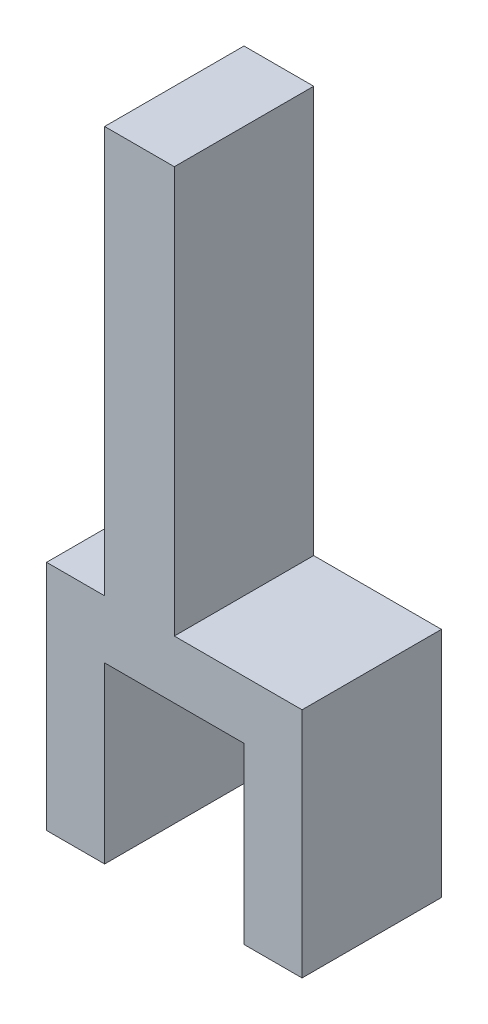
ISO-10303-21;
HEADER;
FILE_DESCRIPTION(('STEP AP214'),'2;1');
FILE_NAME('part.step','',(''),(''),'','','');
FILE_SCHEMA(('AUTOMOTIVE_DESIGN { 1 0 10303 214 1 1 1 1 }'));
ENDSEC;
DATA;
#1=APPLICATION_CONTEXT('core data for automotive mechanical design processes');
#2=APPLICATION_PROTOCOL_DEFINITION('international standard','automotive_design',2000,#1);
#3=PRODUCT_CONTEXT('',#1,'mechanical');
#4=PRODUCT('Part','Part','',(#3));
#5=PRODUCT_RELATED_PRODUCT_CATEGORY('part','',(#4));
#6=PRODUCT_DEFINITION_FORMATION('','',#4);
#7=PRODUCT_DEFINITION_CONTEXT('part definition',#1,'design');
#8=PRODUCT_DEFINITION('design','',#6,#7);
#9=PRODUCT_DEFINITION_SHAPE('','',#8);
#10=(LENGTH_UNIT() NAMED_UNIT(*) SI_UNIT(.MILLI.,.METRE.));
#11=(NAMED_UNIT(*) PLANE_ANGLE_UNIT() SI_UNIT($,.RADIAN.));
#12=(NAMED_UNIT(*) SI_UNIT($,.STERADIAN.) SOLID_ANGLE_UNIT());
#13=UNCERTAINTY_MEASURE_WITH_UNIT(LENGTH_MEASURE(1.E-05),#10,'distance_accuracy_value','');
#14=(GEOMETRIC_REPRESENTATION_CONTEXT(3) GLOBAL_UNCERTAINTY_ASSIGNED_CONTEXT((#13)) GLOBAL_UNIT_ASSIGNED_CONTEXT((#10,
#11,#12)) REPRESENTATION_CONTEXT('',''));
#15=CARTESIAN_POINT('',(0.,0.,0.));
#16=DIRECTION('',(0.,0.,1.));
#17=DIRECTION('',(1.,0.,0.));
#18=AXIS2_PLACEMENT_3D('',#15,#16,#17);
#19=CARTESIAN_POINT('',(0.,20.,12.));
#20=DIRECTION('',(1.,0.,0.));
#21=DIRECTION('',(0.,0.,-1.));
#22=AXIS2_PLACEMENT_3D('',#19,#20,#21);
#23=PLANE('',#22);
#24=DIRECTION('',(0.,-1.,0.));
#25=VECTOR('',#24,1.);
#26=CARTESIAN_POINT('',(0.,20.,0.));
#27=LINE('',#26,#25);
#28=CARTESIAN_POINT('',(0.,20.,0.));
#29=VERTEX_POINT('',#28);
#30=CARTESIAN_POINT('',(0.,0.,0.));
#31=VERTEX_POINT('',#30);
#32=EDGE_CURVE('E155',#29,#31,#27,.T.);
#33=ORIENTED_EDGE('',*,*,#32,.T.);
#34=DIRECTION('',(0.,0.,-1.));
#35=VECTOR('',#34,1.);
#36=CARTESIAN_POINT('',(0.,0.,12.));
#37=LINE('',#36,#35);
#38=CARTESIAN_POINT('',(0.,0.,12.));
#39=VERTEX_POINT('',#38);
#40=EDGE_CURVE('E11',#39,#31,#37,.T.);
#41=ORIENTED_EDGE('',*,*,#40,.F.);
#42=DIRECTION('',(0.,-1.,0.));
#43=VECTOR('',#42,1.);
#44=CARTESIAN_POINT('',(0.,20.,12.));
#45=LINE('',#44,#43);
#46=CARTESIAN_POINT('',(0.,20.,12.));
#47=VERTEX_POINT('',#46);
#48=EDGE_CURVE('E177',#47,#39,#45,.T.);
#49=ORIENTED_EDGE('',*,*,#48,.F.);
#50=DIRECTION('',(0.,0.,-1.));
#51=VECTOR('',#50,1.);
#52=CARTESIAN_POINT('',(0.,20.,12.));
#53=LINE('',#52,#51);
#54=EDGE_CURVE('E151',#47,#29,#53,.T.);
#55=ORIENTED_EDGE('',*,*,#54,.T.);
#56=EDGE_LOOP('',(#33,#41,#49,#55));
#57=FACE_BOUND('',#56,.T.);
#58=ADVANCED_FACE('F35',(#57),#23,.F.);
#59=CARTESIAN_POINT('',(0.,0.,12.));
#60=DIRECTION('',(0.,1.,0.));
#61=DIRECTION('',(0.,0.,1.));
#62=AXIS2_PLACEMENT_3D('',#59,#60,#61);
#63=PLANE('',#62);
#64=DIRECTION('',(1.,0.,0.));
#65=VECTOR('',#64,1.);
#66=CARTESIAN_POINT('',(0.,0.,0.));
#67=LINE('',#66,#65);
#68=CARTESIAN_POINT('',(5.,0.,0.));
#69=VERTEX_POINT('',#68);
#70=EDGE_CURVE('E158',#31,#69,#67,.T.);
#71=ORIENTED_EDGE('',*,*,#70,.T.);
#72=DIRECTION('',(0.,0.,-1.));
#73=VECTOR('',#72,1.);
#74=CARTESIAN_POINT('',(5.,0.,12.));
#75=LINE('',#74,#73);
#76=CARTESIAN_POINT('',(5.,0.,12.));
#77=VERTEX_POINT('',#76);
#78=EDGE_CURVE('E43',#77,#69,#75,.T.);
#79=ORIENTED_EDGE('',*,*,#78,.F.);
#80=DIRECTION('',(1.,0.,0.));
#81=VECTOR('',#80,1.);
#82=CARTESIAN_POINT('',(0.,0.,12.));
#83=LINE('',#82,#81);
#84=EDGE_CURVE('E106',#39,#77,#83,.T.);
#85=ORIENTED_EDGE('',*,*,#84,.F.);
#86=ORIENTED_EDGE('',*,*,#40,.T.);
#87=EDGE_LOOP('',(#71,#79,#85,#86));
#88=FACE_BOUND('',#87,.T.);
#89=ADVANCED_FACE('F255',(#88),#63,.F.);
#90=CARTESIAN_POINT('',(5.,0.,12.));
#91=DIRECTION('',(-1.,0.,0.));
#92=DIRECTION('',(0.,0.,1.));
#93=AXIS2_PLACEMENT_3D('',#90,#91,#92);
#94=PLANE('',#93);
#95=DIRECTION('',(0.,1.,0.));
#96=VECTOR('',#95,1.);
#97=CARTESIAN_POINT('',(5.,0.,0.));
#98=LINE('',#97,#96);
#99=CARTESIAN_POINT('',(5.,15.,0.));
#100=VERTEX_POINT('',#99);
#101=EDGE_CURVE('E160',#69,#100,#98,.T.);
#102=ORIENTED_EDGE('',*,*,#101,.T.);
#103=DIRECTION('',(0.,0.,-1.));
#104=VECTOR('',#103,1.);
#105=CARTESIAN_POINT('',(5.,15.,12.));
#106=LINE('',#105,#104);
#107=CARTESIAN_POINT('',(5.,15.,12.));
#108=VERTEX_POINT('',#107);
#109=EDGE_CURVE('E196',#108,#100,#106,.T.);
#110=ORIENTED_EDGE('',*,*,#109,.F.);
#111=DIRECTION('',(0.,1.,0.));
#112=VECTOR('',#111,1.);
#113=CARTESIAN_POINT('',(5.,0.,12.));
#114=LINE('',#113,#112);
#115=EDGE_CURVE('E204',#77,#108,#114,.T.);
#116=ORIENTED_EDGE('',*,*,#115,.F.);
#117=ORIENTED_EDGE('',*,*,#78,.T.);
#118=EDGE_LOOP('',(#102,#110,#116,#117));
#119=FACE_BOUND('',#118,.T.);
#120=ADVANCED_FACE('F202',(#119),#94,.F.);
#121=CARTESIAN_POINT('',(5.,15.,12.));
#122=DIRECTION('',(0.,1.,0.));
#123=DIRECTION('',(0.,0.,1.));
#124=AXIS2_PLACEMENT_3D('',#121,#122,#123);
#125=PLANE('',#124);
#126=DIRECTION('',(1.,0.,0.));
#127=VECTOR('',#126,1.);
#128=CARTESIAN_POINT('',(5.,15.,0.));
#129=LINE('',#128,#127);
#130=CARTESIAN_POINT('',(17.,15.,0.));
#131=VERTEX_POINT('',#130);
#132=EDGE_CURVE('E162',#100,#131,#129,.T.);
#133=ORIENTED_EDGE('',*,*,#132,.T.);
#134=DIRECTION('',(0.,0.,-1.));
#135=VECTOR('',#134,1.);
#136=CARTESIAN_POINT('',(17.,15.,12.));
#137=LINE('',#136,#135);
#138=CARTESIAN_POINT('',(17.,15.,12.));
#139=VERTEX_POINT('',#138);
#140=EDGE_CURVE('E193',#139,#131,#137,.T.);
#141=ORIENTED_EDGE('',*,*,#140,.F.);
#142=DIRECTION('',(1.,0.,0.));
#143=VECTOR('',#142,1.);
#144=CARTESIAN_POINT('',(5.,15.,12.));
#145=LINE('',#144,#143);
#146=EDGE_CURVE('E222',#108,#139,#145,.T.);
#147=ORIENTED_EDGE('',*,*,#146,.F.);
#148=ORIENTED_EDGE('',*,*,#109,.T.);
#149=EDGE_LOOP('',(#133,#141,#147,#148));
#150=FACE_BOUND('',#149,.T.);
#151=ADVANCED_FACE('F213',(#150),#125,.F.);
#152=CARTESIAN_POINT('',(17.,15.,12.));
#153=DIRECTION('',(1.,0.,0.));
#154=DIRECTION('',(0.,0.,-1.));
#155=AXIS2_PLACEMENT_3D('',#152,#153,#154);
#156=PLANE('',#155);
#157=DIRECTION('',(0.,-1.,0.));
#158=VECTOR('',#157,1.);
#159=CARTESIAN_POINT('',(17.,15.,0.));
#160=LINE('',#159,#158);
#161=CARTESIAN_POINT('',(17.,0.,0.));
#162=VERTEX_POINT('',#161);
#163=EDGE_CURVE('E164',#131,#162,#160,.T.);
#164=ORIENTED_EDGE('',*,*,#163,.T.);
#165=DIRECTION('',(0.,0.,-1.));
#166=VECTOR('',#165,1.);
#167=CARTESIAN_POINT('',(17.,0.,12.));
#168=LINE('',#167,#166);
#169=CARTESIAN_POINT('',(17.,0.,12.));
#170=VERTEX_POINT('',#169);
#171=EDGE_CURVE('E190',#170,#162,#168,.T.);
#172=ORIENTED_EDGE('',*,*,#171,.F.);
#173=DIRECTION('',(0.,-1.,0.));
#174=VECTOR('',#173,1.);
#175=CARTESIAN_POINT('',(17.,15.,12.));
#176=LINE('',#175,#174);
#177=EDGE_CURVE('E219',#139,#170,#176,.T.);
#178=ORIENTED_EDGE('',*,*,#177,.F.);
#179=ORIENTED_EDGE('',*,*,#140,.T.);
#180=EDGE_LOOP('',(#164,#172,#178,#179));
#181=FACE_BOUND('',#180,.T.);
#182=ADVANCED_FACE('F217',(#181),#156,.F.);
#183=CARTESIAN_POINT('',(17.,0.,12.));
#184=DIRECTION('',(0.,1.,0.));
#185=DIRECTION('',(0.,0.,1.));
#186=AXIS2_PLACEMENT_3D('',#183,#184,#185);
#187=PLANE('',#186);
#188=DIRECTION('',(1.,0.,0.));
#189=VECTOR('',#188,1.);
#190=CARTESIAN_POINT('',(17.,0.,0.));
#191=LINE('',#190,#189);
#192=CARTESIAN_POINT('',(22.,0.,0.));
#193=VERTEX_POINT('',#192);
#194=EDGE_CURVE('E166',#162,#193,#191,.T.);
#195=ORIENTED_EDGE('',*,*,#194,.T.);
#196=DIRECTION('',(0.,0.,-1.));
#197=VECTOR('',#196,1.);
#198=CARTESIAN_POINT('',(22.,0.,12.));
#199=LINE('',#198,#197);
#200=CARTESIAN_POINT('',(22.,0.,12.));
#201=VERTEX_POINT('',#200);
#202=EDGE_CURVE('E187',#201,#193,#199,.T.);
#203=ORIENTED_EDGE('',*,*,#202,.F.);
#204=DIRECTION('',(1.,0.,0.));
#205=VECTOR('',#204,1.);
#206=CARTESIAN_POINT('',(17.,0.,12.));
#207=LINE('',#206,#205);
#208=EDGE_CURVE('E221',#170,#201,#207,.T.);
#209=ORIENTED_EDGE('',*,*,#208,.F.);
#210=ORIENTED_EDGE('',*,*,#171,.T.);
#211=EDGE_LOOP('',(#195,#203,#209,#210));
#212=FACE_BOUND('',#211,.T.);
#213=ADVANCED_FACE('F268',(#212),#187,.F.);
#214=CARTESIAN_POINT('',(22.,0.,12.));
#215=DIRECTION('',(-1.,0.,0.));
#216=DIRECTION('',(0.,-1.,0.));
#217=AXIS2_PLACEMENT_3D('',#214,#215,#216);
#218=PLANE('',#217);
#219=DIRECTION('',(0.,1.,0.));
#220=VECTOR('',#219,1.);
#221=CARTESIAN_POINT('',(22.,0.,0.));
#222=LINE('',#221,#220);
#223=CARTESIAN_POINT('',(22.,20.,0.));
#224=VERTEX_POINT('',#223);
#225=EDGE_CURVE('E168',#193,#224,#222,.T.);
#226=ORIENTED_EDGE('',*,*,#225,.T.);
#227=DIRECTION('',(0.,0.,-1.));
#228=VECTOR('',#227,1.);
#229=CARTESIAN_POINT('',(22.,20.,12.));
#230=LINE('',#229,#228);
#231=CARTESIAN_POINT('',(22.,20.,12.));
#232=VERTEX_POINT('',#231);
#233=EDGE_CURVE('E184',#232,#224,#230,.T.);
#234=ORIENTED_EDGE('',*,*,#233,.F.);
#235=DIRECTION('',(0.,1.,0.));
#236=VECTOR('',#235,1.);
#237=CARTESIAN_POINT('',(22.,0.,12.));
#238=LINE('',#237,#236);
#239=EDGE_CURVE('E224',#201,#232,#238,.T.);
#240=ORIENTED_EDGE('',*,*,#239,.F.);
#241=ORIENTED_EDGE('',*,*,#202,.T.);
#242=EDGE_LOOP('',(#226,#234,#240,#241));
#243=FACE_BOUND('',#242,.T.);
#244=ADVANCED_FACE('F271',(#243),#218,.F.);
#245=CARTESIAN_POINT('',(22.,20.,12.));
#246=DIRECTION('',(0.,-1.,0.));
#247=DIRECTION('',(1.,0.,0.));
#248=AXIS2_PLACEMENT_3D('',#245,#246,#247);
#249=PLANE('',#248);
#250=DIRECTION('',(-1.,0.,0.));
#251=VECTOR('',#250,1.);
#252=CARTESIAN_POINT('',(22.,20.,0.));
#253=LINE('',#252,#251);
#254=CARTESIAN_POINT('',(11.,20.,0.));
#255=VERTEX_POINT('',#254);
#256=EDGE_CURVE('E170',#224,#255,#253,.T.);
#257=ORIENTED_EDGE('',*,*,#256,.T.);
#258=DIRECTION('',(0.,0.,-1.));
#259=VECTOR('',#258,1.);
#260=CARTESIAN_POINT('',(11.,20.,12.));
#261=LINE('',#260,#259);
#262=CARTESIAN_POINT('',(11.,20.,12.));
#263=VERTEX_POINT('',#262);
#264=EDGE_CURVE('E181',#263,#255,#261,.T.);
#265=ORIENTED_EDGE('',*,*,#264,.F.);
#266=DIRECTION('',(-1.,0.,0.));
#267=VECTOR('',#266,1.);
#268=CARTESIAN_POINT('',(22.,20.,12.));
#269=LINE('',#268,#267);
#270=EDGE_CURVE('E230',#232,#263,#269,.T.);
#271=ORIENTED_EDGE('',*,*,#270,.F.);
#272=ORIENTED_EDGE('',*,*,#233,.T.);
#273=EDGE_LOOP('',(#257,#265,#271,#272));
#274=FACE_BOUND('',#273,.T.);
#275=ADVANCED_FACE('F236',(#274),#249,.F.);
#276=CARTESIAN_POINT('',(11.,20.,12.));
#277=DIRECTION('',(-1.,0.,0.));
#278=DIRECTION('',(0.,0.,1.));
#279=AXIS2_PLACEMENT_3D('',#276,#277,#278);
#280=PLANE('',#279);
#281=DIRECTION('',(0.,1.,0.));
#282=VECTOR('',#281,1.);
#283=CARTESIAN_POINT('',(11.,20.,0.));
#284=LINE('',#283,#282);
#285=CARTESIAN_POINT('',(11.,55.,0.));
#286=VERTEX_POINT('',#285);
#287=EDGE_CURVE('E172',#255,#286,#284,.T.);
#288=ORIENTED_EDGE('',*,*,#287,.T.);
#289=DIRECTION('',(0.,0.,-1.));
#290=VECTOR('',#289,1.);
#291=CARTESIAN_POINT('',(11.,55.,12.));
#292=LINE('',#291,#290);
#293=CARTESIAN_POINT('',(11.,55.,12.));
#294=VERTEX_POINT('',#293);
#295=EDGE_CURVE('E146',#294,#286,#292,.T.);
#296=ORIENTED_EDGE('',*,*,#295,.F.);
#297=DIRECTION('',(0.,1.,0.));
#298=VECTOR('',#297,1.);
#299=CARTESIAN_POINT('',(11.,20.,12.));
#300=LINE('',#299,#298);
#301=EDGE_CURVE('E137',#263,#294,#300,.T.);
#302=ORIENTED_EDGE('',*,*,#301,.F.);
#303=ORIENTED_EDGE('',*,*,#264,.T.);
#304=EDGE_LOOP('',(#288,#296,#302,#303));
#305=FACE_BOUND('',#304,.T.);
#306=ADVANCED_FACE('F240',(#305),#280,.F.);
#307=CARTESIAN_POINT('',(11.,55.,12.));
#308=DIRECTION('',(0.,-1.,0.));
#309=DIRECTION('',(0.,0.,-1.));
#310=AXIS2_PLACEMENT_3D('',#307,#308,#309);
#311=PLANE('',#310);
#312=DIRECTION('',(-1.,0.,0.));
#313=VECTOR('',#312,1.);
#314=CARTESIAN_POINT('',(11.,55.,0.));
#315=LINE('',#314,#313);
#316=CARTESIAN_POINT('',(5.,55.,0.));
#317=VERTEX_POINT('',#316);
#318=EDGE_CURVE('E145',#286,#317,#315,.T.);
#319=ORIENTED_EDGE('',*,*,#318,.T.);
#320=DIRECTION('',(0.,0.,-1.));
#321=VECTOR('',#320,1.);
#322=CARTESIAN_POINT('',(5.,55.,12.));
#323=LINE('',#322,#321);
#324=CARTESIAN_POINT('',(5.,55.,12.));
#325=VERTEX_POINT('',#324);
#326=EDGE_CURVE('E142',#325,#317,#323,.T.);
#327=ORIENTED_EDGE('',*,*,#326,.F.);
#328=DIRECTION('',(-1.,0.,0.));
#329=VECTOR('',#328,1.);
#330=CARTESIAN_POINT('',(11.,55.,12.));
#331=LINE('',#330,#329);
#332=EDGE_CURVE('E131',#294,#325,#331,.T.);
#333=ORIENTED_EDGE('',*,*,#332,.F.);
#334=ORIENTED_EDGE('',*,*,#295,.T.);
#335=EDGE_LOOP('',(#319,#327,#333,#334));
#336=FACE_BOUND('',#335,.T.);
#337=ADVANCED_FACE('F143',(#336),#311,.F.);
#338=CARTESIAN_POINT('',(5.,55.,12.));
#339=DIRECTION('',(1.,0.,0.));
#340=DIRECTION('',(0.,1.,0.));
#341=AXIS2_PLACEMENT_3D('',#338,#339,#340);
#342=PLANE('',#341);
#343=DIRECTION('',(0.,-1.,0.));
#344=VECTOR('',#343,1.);
#345=CARTESIAN_POINT('',(5.,55.,0.));
#346=LINE('',#345,#344);
#347=CARTESIAN_POINT('',(5.,20.,0.));
#348=VERTEX_POINT('',#347);
#349=EDGE_CURVE('E92',#317,#348,#346,.T.);
#350=ORIENTED_EDGE('',*,*,#349,.T.);
#351=DIRECTION('',(0.,0.,-1.));
#352=VECTOR('',#351,1.);
#353=CARTESIAN_POINT('',(5.,20.,12.));
#354=LINE('',#353,#352);
#355=CARTESIAN_POINT('',(5.,20.,12.));
#356=VERTEX_POINT('',#355);
#357=EDGE_CURVE('E147',#356,#348,#354,.T.);
#358=ORIENTED_EDGE('',*,*,#357,.F.);
#359=DIRECTION('',(0.,-1.,0.));
#360=VECTOR('',#359,1.);
#361=CARTESIAN_POINT('',(5.,55.,12.));
#362=LINE('',#361,#360);
#363=EDGE_CURVE('E135',#325,#356,#362,.T.);
#364=ORIENTED_EDGE('',*,*,#363,.F.);
#365=ORIENTED_EDGE('',*,*,#326,.T.);
#366=EDGE_LOOP('',(#350,#358,#364,#365));
#367=FACE_BOUND('',#366,.T.);
#368=ADVANCED_FACE('F149',(#367),#342,.F.);
#369=CARTESIAN_POINT('',(5.,20.,12.));
#370=DIRECTION('',(0.,-1.,0.));
#371=DIRECTION('',(0.,0.,-1.));
#372=AXIS2_PLACEMENT_3D('',#369,#370,#371);
#373=PLANE('',#372);
#374=DIRECTION('',(-1.,0.,0.));
#375=VECTOR('',#374,1.);
#376=CARTESIAN_POINT('',(5.,20.,0.));
#377=LINE('',#376,#375);
#378=EDGE_CURVE('E98',#348,#29,#377,.T.);
#379=ORIENTED_EDGE('',*,*,#378,.T.);
#380=ORIENTED_EDGE('',*,*,#54,.F.);
#381=DIRECTION('',(-1.,0.,0.));
#382=VECTOR('',#381,1.);
#383=CARTESIAN_POINT('',(5.,20.,12.));
#384=LINE('',#383,#382);
#385=EDGE_CURVE('E51',#356,#47,#384,.T.);
#386=ORIENTED_EDGE('',*,*,#385,.F.);
#387=ORIENTED_EDGE('',*,*,#357,.T.);
#388=EDGE_LOOP('',(#379,#380,#386,#387));
#389=FACE_BOUND('',#388,.T.);
#390=ADVANCED_FACE('F244',(#389),#373,.F.);
#391=CARTESIAN_POINT('',(0.,0.,12.));
#392=DIRECTION('',(0.,0.,1.));
#393=DIRECTION('',(1.,0.,0.));
#394=AXIS2_PLACEMENT_3D('',#391,#392,#393);
#395=PLANE('',#394);
#396=ORIENTED_EDGE('',*,*,#48,.T.);
#397=ORIENTED_EDGE('',*,*,#84,.T.);
#398=ORIENTED_EDGE('',*,*,#115,.T.);
#399=ORIENTED_EDGE('',*,*,#146,.T.);
#400=ORIENTED_EDGE('',*,*,#177,.T.);
#401=ORIENTED_EDGE('',*,*,#208,.T.);
#402=ORIENTED_EDGE('',*,*,#239,.T.);
#403=ORIENTED_EDGE('',*,*,#270,.T.);
#404=ORIENTED_EDGE('',*,*,#301,.T.);
#405=ORIENTED_EDGE('',*,*,#332,.T.);
#406=ORIENTED_EDGE('',*,*,#363,.T.);
#407=ORIENTED_EDGE('',*,*,#385,.T.);
#408=EDGE_LOOP('',(#396,#397,#398,#399,#400,#401,#402,#403,#404,#405,#406,#407));
#409=FACE_BOUND('',#408,.T.);
#410=ADVANCED_FACE('F133',(#409),#395,.T.);
#411=CARTESIAN_POINT('',(0.,0.,0.));
#412=DIRECTION('',(0.,0.,1.));
#413=DIRECTION('',(1.,0.,0.));
#414=AXIS2_PLACEMENT_3D('',#411,#412,#413);
#415=PLANE('',#414);
#416=ORIENTED_EDGE('',*,*,#32,.F.);
#417=ORIENTED_EDGE('',*,*,#378,.F.);
#418=ORIENTED_EDGE('',*,*,#349,.F.);
#419=ORIENTED_EDGE('',*,*,#318,.F.);
#420=ORIENTED_EDGE('',*,*,#287,.F.);
#421=ORIENTED_EDGE('',*,*,#256,.F.);
#422=ORIENTED_EDGE('',*,*,#225,.F.);
#423=ORIENTED_EDGE('',*,*,#194,.F.);
#424=ORIENTED_EDGE('',*,*,#163,.F.);
#425=ORIENTED_EDGE('',*,*,#132,.F.);
#426=ORIENTED_EDGE('',*,*,#101,.F.);
#427=ORIENTED_EDGE('',*,*,#70,.F.);
#428=EDGE_LOOP('',(#416,#417,#418,#419,#420,#421,#422,#423,#424,#425,#426,#427));
#429=FACE_BOUND('',#428,.T.);
#430=ADVANCED_FACE('F208',(#429),#415,.F.);
#431=CLOSED_SHELL('',(#58,#89,#120,#151,#182,#213,#244,#275,#306,#337,#368,#390,#410,#430));
#432=MANIFOLD_SOLID_BREP('B2',#431);
#433=ADVANCED_BREP_SHAPE_REPRESENTATION('',(#18,#432),#14);
#434=SHAPE_DEFINITION_REPRESENTATION(#9,#433);
ENDSEC;
END-ISO-10303-21;
